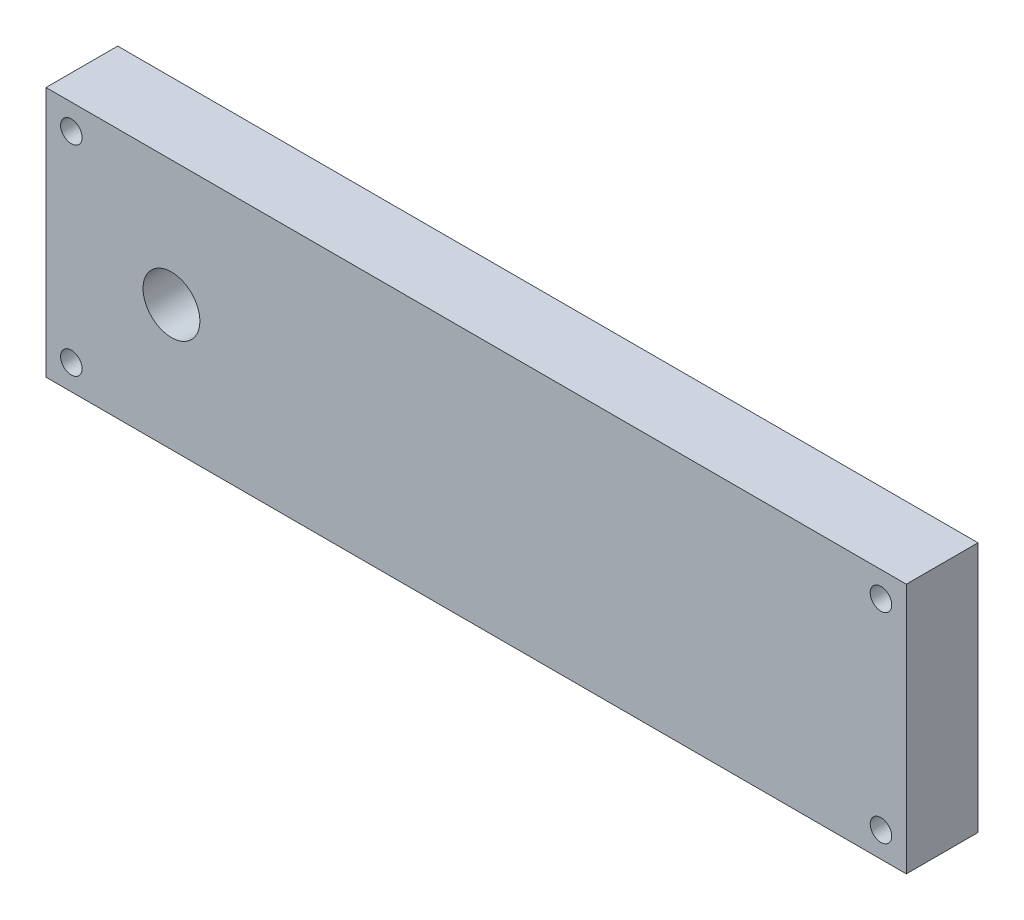
ISO-10303-21;
HEADER;
FILE_DESCRIPTION(('STEP AP214'),'2;1');
FILE_NAME('part.step','',(''),(''),'','','');
FILE_SCHEMA(('AUTOMOTIVE_DESIGN { 1 0 10303 214 1 1 1 1 }'));
ENDSEC;
DATA;
#1=APPLICATION_CONTEXT('core data for automotive mechanical design processes');
#2=APPLICATION_PROTOCOL_DEFINITION('international standard','automotive_design',2000,#1);
#3=PRODUCT_CONTEXT('',#1,'mechanical');
#4=PRODUCT('Part','Part','',(#3));
#5=PRODUCT_RELATED_PRODUCT_CATEGORY('part','',(#4));
#6=PRODUCT_DEFINITION_FORMATION('','',#4);
#7=PRODUCT_DEFINITION_CONTEXT('part definition',#1,'design');
#8=PRODUCT_DEFINITION('design','',#6,#7);
#9=PRODUCT_DEFINITION_SHAPE('','',#8);
#10=(LENGTH_UNIT() NAMED_UNIT(*) SI_UNIT(.MILLI.,.METRE.));
#11=(NAMED_UNIT(*) PLANE_ANGLE_UNIT() SI_UNIT($,.RADIAN.));
#12=(NAMED_UNIT(*) SI_UNIT($,.STERADIAN.) SOLID_ANGLE_UNIT());
#13=UNCERTAINTY_MEASURE_WITH_UNIT(LENGTH_MEASURE(1.E-05),#10,'distance_accuracy_value','');
#14=(GEOMETRIC_REPRESENTATION_CONTEXT(3) GLOBAL_UNCERTAINTY_ASSIGNED_CONTEXT((#13)) GLOBAL_UNIT_ASSIGNED_CONTEXT((#10,
#11,#12)) REPRESENTATION_CONTEXT('',''));
#15=CARTESIAN_POINT('',(0.,0.,0.));
#16=DIRECTION('',(0.,0.,1.));
#17=DIRECTION('',(1.,0.,0.));
#18=AXIS2_PLACEMENT_3D('',#15,#16,#17);
#19=CARTESIAN_POINT('',(0.,0.,10.));
#20=DIRECTION('',(0.,0.,1.));
#21=DIRECTION('',(1.,0.,0.));
#22=AXIS2_PLACEMENT_3D('',#19,#20,#21);
#23=PLANE('',#22);
#24=CARTESIAN_POINT('',(83.0553751849764,11.2940115486127,10.));
#25=DIRECTION('',(0.,0.,1.));
#26=DIRECTION('',(1.,0.,0.));
#27=AXIS2_PLACEMENT_3D('',#24,#25,#26);
#28=CIRCLE('',#27,1.5);
#29=CARTESIAN_POINT('',(84.5553751849764,11.2940115486127,10.));
#30=VERTEX_POINT('',#29);
#31=EDGE_CURVE('E129',#30,#30,#28,.T.);
#32=ORIENTED_EDGE('',*,*,#31,.F.);
#33=EDGE_LOOP('',(#32));
#34=FACE_BOUND('',#33,.T.);
#35=CARTESIAN_POINT('',(-15.9090909090909,-2.67045454545453,10.));
#36=DIRECTION('',(0.,0.,1.));
#37=DIRECTION('',(1.,0.,0.));
#38=AXIS2_PLACEMENT_3D('',#35,#36,#37);
#39=CIRCLE('',#38,3.965);
#40=CARTESIAN_POINT('',(-11.9440909090909,-2.67045454545453,10.));
#41=VERTEX_POINT('',#40);
#42=EDGE_CURVE('E117',#41,#41,#39,.T.);
#43=ORIENTED_EDGE('',*,*,#42,.F.);
#44=EDGE_LOOP('',(#43));
#45=FACE_BOUND('',#44,.T.);
#46=DIRECTION('',(0.,-1.,0.));
#47=VECTOR('',#46,1.);
#48=CARTESIAN_POINT('',(-33.4090909090909,14.8295454545455,10.));
#49=LINE('',#48,#47);
#50=CARTESIAN_POINT('',(-33.4090909090909,14.8295454545455,10.));
#51=VERTEX_POINT('',#50);
#52=CARTESIAN_POINT('',(-33.4090909090909,-20.1704545454545,10.));
#53=VERTEX_POINT('',#52);
#54=EDGE_CURVE('E87',#51,#53,#49,.T.);
#55=ORIENTED_EDGE('',*,*,#54,.T.);
#56=DIRECTION('',(1.,0.,0.));
#57=VECTOR('',#56,1.);
#58=CARTESIAN_POINT('',(-33.4090909090909,-20.1704545454545,10.));
#59=LINE('',#58,#57);
#60=CARTESIAN_POINT('',(86.5909090909091,-20.1704545454545,10.));
#61=VERTEX_POINT('',#60);
#62=EDGE_CURVE('E82',#53,#61,#59,.T.);
#63=ORIENTED_EDGE('',*,*,#62,.T.);
#64=DIRECTION('',(0.,1.,0.));
#65=VECTOR('',#64,1.);
#66=CARTESIAN_POINT('',(86.5909090909091,14.8295454545455,10.));
#67=LINE('',#66,#65);
#68=CARTESIAN_POINT('',(86.5909090909091,14.8295454545455,10.));
#69=VERTEX_POINT('',#68);
#70=EDGE_CURVE('E85',#61,#69,#67,.T.);
#71=ORIENTED_EDGE('',*,*,#70,.T.);
#72=DIRECTION('',(-1.,0.,0.));
#73=VECTOR('',#72,1.);
#74=CARTESIAN_POINT('',(-33.4090909090909,14.8295454545455,10.));
#75=LINE('',#74,#73);
#76=EDGE_CURVE('E52',#69,#51,#75,.T.);
#77=ORIENTED_EDGE('',*,*,#76,.T.);
#78=EDGE_LOOP('',(#55,#63,#71,#77));
#79=FACE_BOUND('',#78,.T.);
#80=CARTESIAN_POINT('',(-29.8735570031582,-16.6349206395218,10.));
#81=DIRECTION('',(0.,0.,1.));
#82=DIRECTION('',(1.,0.,0.));
#83=AXIS2_PLACEMENT_3D('',#80,#81,#82);
#84=CIRCLE('',#83,1.5);
#85=CARTESIAN_POINT('',(-28.3735570031582,-16.6349206395218,10.));
#86=VERTEX_POINT('',#85);
#87=EDGE_CURVE('E102',#86,#86,#84,.T.);
#88=ORIENTED_EDGE('',*,*,#87,.F.);
#89=EDGE_LOOP('',(#88));
#90=FACE_BOUND('',#89,.T.);
#91=CARTESIAN_POINT('',(-29.8735570031582,11.2940115486127,10.));
#92=DIRECTION('',(0.,0.,1.));
#93=DIRECTION('',(-1.,0.,0.));
#94=AXIS2_PLACEMENT_3D('',#91,#92,#93);
#95=CIRCLE('',#94,1.5);
#96=CARTESIAN_POINT('',(-31.3735570031582,11.2940115486127,10.));
#97=VERTEX_POINT('',#96);
#98=EDGE_CURVE('E123',#97,#97,#95,.T.);
#99=ORIENTED_EDGE('',*,*,#98,.F.);
#100=EDGE_LOOP('',(#99));
#101=FACE_BOUND('',#100,.T.);
#102=CARTESIAN_POINT('',(83.0553751849764,-16.6349206395218,10.));
#103=DIRECTION('',(0.,0.,1.));
#104=DIRECTION('',(-1.,0.,0.));
#105=AXIS2_PLACEMENT_3D('',#102,#103,#104);
#106=CIRCLE('',#105,1.5);
#107=CARTESIAN_POINT('',(81.5553751849764,-16.6349206395218,10.));
#108=VERTEX_POINT('',#107);
#109=EDGE_CURVE('E135',#108,#108,#106,.T.);
#110=ORIENTED_EDGE('',*,*,#109,.F.);
#111=EDGE_LOOP('',(#110));
#112=FACE_BOUND('',#111,.T.);
#113=ADVANCED_FACE('F35',(#34,#45,#79,#90,#101,#112),#23,.T.);
#114=CARTESIAN_POINT('',(0.,0.,0.));
#115=DIRECTION('',(0.,0.,1.));
#116=DIRECTION('',(1.,0.,0.));
#117=AXIS2_PLACEMENT_3D('',#114,#115,#116);
#118=PLANE('',#117);
#119=DIRECTION('',(0.,-1.,0.));
#120=VECTOR('',#119,1.);
#121=CARTESIAN_POINT('',(-33.4090909090909,14.8295454545455,0.));
#122=LINE('',#121,#120);
#123=CARTESIAN_POINT('',(-33.4090909090909,14.8295454545455,0.));
#124=VERTEX_POINT('',#123);
#125=CARTESIAN_POINT('',(-33.4090909090909,-20.1704545454545,0.));
#126=VERTEX_POINT('',#125);
#127=EDGE_CURVE('E99',#124,#126,#122,.T.);
#128=ORIENTED_EDGE('',*,*,#127,.F.);
#129=DIRECTION('',(-1.,0.,0.));
#130=VECTOR('',#129,1.);
#131=CARTESIAN_POINT('',(-33.4090909090909,14.8295454545455,0.));
#132=LINE('',#131,#130);
#133=CARTESIAN_POINT('',(86.5909090909091,14.8295454545455,0.));
#134=VERTEX_POINT('',#133);
#135=EDGE_CURVE('E75',#134,#124,#132,.T.);
#136=ORIENTED_EDGE('',*,*,#135,.F.);
#137=DIRECTION('',(0.,1.,0.));
#138=VECTOR('',#137,1.);
#139=CARTESIAN_POINT('',(86.5909090909091,14.8295454545455,0.));
#140=LINE('',#139,#138);
#141=CARTESIAN_POINT('',(86.5909090909091,-20.1704545454545,0.));
#142=VERTEX_POINT('',#141);
#143=EDGE_CURVE('E69',#142,#134,#140,.T.);
#144=ORIENTED_EDGE('',*,*,#143,.F.);
#145=DIRECTION('',(1.,0.,0.));
#146=VECTOR('',#145,1.);
#147=CARTESIAN_POINT('',(-33.4090909090909,-20.1704545454545,0.));
#148=LINE('',#147,#146);
#149=EDGE_CURVE('E91',#126,#142,#148,.T.);
#150=ORIENTED_EDGE('',*,*,#149,.F.);
#151=EDGE_LOOP('',(#128,#136,#144,#150));
#152=FACE_BOUND('',#151,.T.);
#153=CARTESIAN_POINT('',(-29.8735570031582,-16.6349206395218,0.));
#154=DIRECTION('',(0.,0.,1.));
#155=DIRECTION('',(1.,0.,0.));
#156=AXIS2_PLACEMENT_3D('',#153,#154,#155);
#157=CIRCLE('',#156,1.5);
#158=CARTESIAN_POINT('',(-28.3735570031582,-16.6349206395218,0.));
#159=VERTEX_POINT('',#158);
#160=EDGE_CURVE('E114',#159,#159,#157,.T.);
#161=ORIENTED_EDGE('',*,*,#160,.T.);
#162=EDGE_LOOP('',(#161));
#163=FACE_BOUND('',#162,.T.);
#164=CARTESIAN_POINT('',(-15.9090909090909,-2.67045454545453,0.));
#165=DIRECTION('',(0.,0.,1.));
#166=DIRECTION('',(1.,0.,0.));
#167=AXIS2_PLACEMENT_3D('',#164,#165,#166);
#168=CIRCLE('',#167,3.965);
#169=CARTESIAN_POINT('',(-11.9440909090909,-2.67045454545453,0.));
#170=VERTEX_POINT('',#169);
#171=EDGE_CURVE('E120',#170,#170,#168,.T.);
#172=ORIENTED_EDGE('',*,*,#171,.T.);
#173=EDGE_LOOP('',(#172));
#174=FACE_BOUND('',#173,.T.);
#175=CARTESIAN_POINT('',(-29.8735570031582,11.2940115486127,0.));
#176=DIRECTION('',(0.,0.,1.));
#177=DIRECTION('',(-1.,0.,0.));
#178=AXIS2_PLACEMENT_3D('',#175,#176,#177);
#179=CIRCLE('',#178,1.5);
#180=CARTESIAN_POINT('',(-31.3735570031582,11.2940115486127,0.));
#181=VERTEX_POINT('',#180);
#182=EDGE_CURVE('E126',#181,#181,#179,.T.);
#183=ORIENTED_EDGE('',*,*,#182,.T.);
#184=EDGE_LOOP('',(#183));
#185=FACE_BOUND('',#184,.T.);
#186=CARTESIAN_POINT('',(83.0553751849764,11.2940115486127,0.));
#187=DIRECTION('',(0.,0.,1.));
#188=DIRECTION('',(1.,0.,0.));
#189=AXIS2_PLACEMENT_3D('',#186,#187,#188);
#190=CIRCLE('',#189,1.5);
#191=CARTESIAN_POINT('',(84.5553751849764,11.2940115486127,0.));
#192=VERTEX_POINT('',#191);
#193=EDGE_CURVE('E132',#192,#192,#190,.T.);
#194=ORIENTED_EDGE('',*,*,#193,.T.);
#195=EDGE_LOOP('',(#194));
#196=FACE_BOUND('',#195,.T.);
#197=CARTESIAN_POINT('',(83.0553751849764,-16.6349206395218,0.));
#198=DIRECTION('',(0.,0.,1.));
#199=DIRECTION('',(-1.,0.,0.));
#200=AXIS2_PLACEMENT_3D('',#197,#198,#199);
#201=CIRCLE('',#200,1.5);
#202=CARTESIAN_POINT('',(81.5553751849764,-16.6349206395218,0.));
#203=VERTEX_POINT('',#202);
#204=EDGE_CURVE('E138',#203,#203,#201,.T.);
#205=ORIENTED_EDGE('',*,*,#204,.T.);
#206=EDGE_LOOP('',(#205));
#207=FACE_BOUND('',#206,.T.);
#208=ADVANCED_FACE('F110',(#152,#163,#174,#185,#196,#207),#118,.F.);
#209=CARTESIAN_POINT('',(-33.4090909090909,14.8295454545455,10.));
#210=DIRECTION('',(1.,0.,0.));
#211=DIRECTION('',(0.,0.,-1.));
#212=AXIS2_PLACEMENT_3D('',#209,#210,#211);
#213=PLANE('',#212);
#214=ORIENTED_EDGE('',*,*,#127,.T.);
#215=DIRECTION('',(0.,0.,-1.));
#216=VECTOR('',#215,1.);
#217=CARTESIAN_POINT('',(-33.4090909090909,-20.1704545454545,10.));
#218=LINE('',#217,#216);
#219=EDGE_CURVE('E11',#53,#126,#218,.T.);
#220=ORIENTED_EDGE('',*,*,#219,.F.);
#221=ORIENTED_EDGE('',*,*,#54,.F.);
#222=DIRECTION('',(0.,0.,-1.));
#223=VECTOR('',#222,1.);
#224=CARTESIAN_POINT('',(-33.4090909090909,14.8295454545455,10.));
#225=LINE('',#224,#223);
#226=EDGE_CURVE('E95',#51,#124,#225,.T.);
#227=ORIENTED_EDGE('',*,*,#226,.T.);
#228=EDGE_LOOP('',(#214,#220,#221,#227));
#229=FACE_BOUND('',#228,.T.);
#230=ADVANCED_FACE('F37',(#229),#213,.F.);
#231=CARTESIAN_POINT('',(-33.4090909090909,-20.1704545454545,10.));
#232=DIRECTION('',(0.,1.,0.));
#233=DIRECTION('',(0.,0.,1.));
#234=AXIS2_PLACEMENT_3D('',#231,#232,#233);
#235=PLANE('',#234);
#236=ORIENTED_EDGE('',*,*,#149,.T.);
#237=DIRECTION('',(0.,0.,-1.));
#238=VECTOR('',#237,1.);
#239=CARTESIAN_POINT('',(86.5909090909091,-20.1704545454545,10.));
#240=LINE('',#239,#238);
#241=EDGE_CURVE('E44',#61,#142,#240,.T.);
#242=ORIENTED_EDGE('',*,*,#241,.F.);
#243=ORIENTED_EDGE('',*,*,#62,.F.);
#244=ORIENTED_EDGE('',*,*,#219,.T.);
#245=EDGE_LOOP('',(#236,#242,#243,#244));
#246=FACE_BOUND('',#245,.T.);
#247=ADVANCED_FACE('F90',(#246),#235,.F.);
#248=CARTESIAN_POINT('',(86.5909090909091,14.8295454545455,10.));
#249=DIRECTION('',(-1.,0.,0.));
#250=DIRECTION('',(0.,0.,1.));
#251=AXIS2_PLACEMENT_3D('',#248,#249,#250);
#252=PLANE('',#251);
#253=ORIENTED_EDGE('',*,*,#143,.T.);
#254=DIRECTION('',(0.,0.,-1.));
#255=VECTOR('',#254,1.);
#256=CARTESIAN_POINT('',(86.5909090909091,14.8295454545455,10.));
#257=LINE('',#256,#255);
#258=EDGE_CURVE('E92',#69,#134,#257,.T.);
#259=ORIENTED_EDGE('',*,*,#258,.F.);
#260=ORIENTED_EDGE('',*,*,#70,.F.);
#261=ORIENTED_EDGE('',*,*,#241,.T.);
#262=EDGE_LOOP('',(#253,#259,#260,#261));
#263=FACE_BOUND('',#262,.T.);
#264=ADVANCED_FACE('F93',(#263),#252,.F.);
#265=CARTESIAN_POINT('',(-33.4090909090909,14.8295454545455,10.));
#266=DIRECTION('',(0.,-1.,0.));
#267=DIRECTION('',(0.,0.,-1.));
#268=AXIS2_PLACEMENT_3D('',#265,#266,#267);
#269=PLANE('',#268);
#270=ORIENTED_EDGE('',*,*,#135,.T.);
#271=ORIENTED_EDGE('',*,*,#226,.F.);
#272=ORIENTED_EDGE('',*,*,#76,.F.);
#273=ORIENTED_EDGE('',*,*,#258,.T.);
#274=EDGE_LOOP('',(#270,#271,#272,#273));
#275=FACE_BOUND('',#274,.T.);
#276=ADVANCED_FACE('F107',(#275),#269,.F.);
#277=CARTESIAN_POINT('',(-29.8735570031582,-16.6349206395218,10.));
#278=DIRECTION('',(0.,0.,-1.));
#279=DIRECTION('',(-1.,0.,0.));
#280=AXIS2_PLACEMENT_3D('',#277,#278,#279);
#281=CYLINDRICAL_SURFACE('',#280,1.5);
#282=ORIENTED_EDGE('',*,*,#87,.T.);
#283=EDGE_LOOP('',(#282));
#284=FACE_BOUND('',#283,.T.);
#285=ORIENTED_EDGE('',*,*,#160,.F.);
#286=EDGE_LOOP('',(#285));
#287=FACE_BOUND('',#286,.T.);
#288=ADVANCED_FACE('F157',(#284,#287),#281,.F.);
#289=CARTESIAN_POINT('',(-15.9090909090909,-2.67045454545453,10.));
#290=DIRECTION('',(0.,0.,-1.));
#291=DIRECTION('',(-1.,0.,0.));
#292=AXIS2_PLACEMENT_3D('',#289,#290,#291);
#293=CYLINDRICAL_SURFACE('',#292,3.965);
#294=ORIENTED_EDGE('',*,*,#42,.T.);
#295=EDGE_LOOP('',(#294));
#296=FACE_BOUND('',#295,.T.);
#297=ORIENTED_EDGE('',*,*,#171,.F.);
#298=EDGE_LOOP('',(#297));
#299=FACE_BOUND('',#298,.T.);
#300=ADVANCED_FACE('F203',(#296,#299),#293,.F.);
#301=CARTESIAN_POINT('',(-29.8735570031582,11.2940115486127,10.));
#302=DIRECTION('',(0.,0.,-1.));
#303=DIRECTION('',(-1.,0.,0.));
#304=AXIS2_PLACEMENT_3D('',#301,#302,#303);
#305=CYLINDRICAL_SURFACE('',#304,1.5);
#306=ORIENTED_EDGE('',*,*,#98,.T.);
#307=EDGE_LOOP('',(#306));
#308=FACE_BOUND('',#307,.T.);
#309=ORIENTED_EDGE('',*,*,#182,.F.);
#310=EDGE_LOOP('',(#309));
#311=FACE_BOUND('',#310,.T.);
#312=ADVANCED_FACE('F211',(#308,#311),#305,.F.);
#313=CARTESIAN_POINT('',(83.0553751849764,11.2940115486127,10.));
#314=DIRECTION('',(0.,0.,-1.));
#315=DIRECTION('',(-1.,0.,0.));
#316=AXIS2_PLACEMENT_3D('',#313,#314,#315);
#317=CYLINDRICAL_SURFACE('',#316,1.5);
#318=ORIENTED_EDGE('',*,*,#31,.T.);
#319=EDGE_LOOP('',(#318));
#320=FACE_BOUND('',#319,.T.);
#321=ORIENTED_EDGE('',*,*,#193,.F.);
#322=EDGE_LOOP('',(#321));
#323=FACE_BOUND('',#322,.T.);
#324=ADVANCED_FACE('F219',(#320,#323),#317,.F.);
#325=CARTESIAN_POINT('',(83.0553751849764,-16.6349206395218,10.));
#326=DIRECTION('',(0.,0.,-1.));
#327=DIRECTION('',(-1.,0.,0.));
#328=AXIS2_PLACEMENT_3D('',#325,#326,#327);
#329=CYLINDRICAL_SURFACE('',#328,1.5);
#330=ORIENTED_EDGE('',*,*,#109,.T.);
#331=EDGE_LOOP('',(#330));
#332=FACE_BOUND('',#331,.T.);
#333=ORIENTED_EDGE('',*,*,#204,.F.);
#334=EDGE_LOOP('',(#333));
#335=FACE_BOUND('',#334,.T.);
#336=ADVANCED_FACE('F144',(#332,#335),#329,.F.);
#337=CLOSED_SHELL('',(#113,#208,#230,#247,#264,#276,#288,#300,#312,#324,#336));
#338=MANIFOLD_SOLID_BREP('B2',#337);
#339=ADVANCED_BREP_SHAPE_REPRESENTATION('',(#18,#338),#14);
#340=SHAPE_DEFINITION_REPRESENTATION(#9,#339);
ENDSEC;
END-ISO-10303-21;
